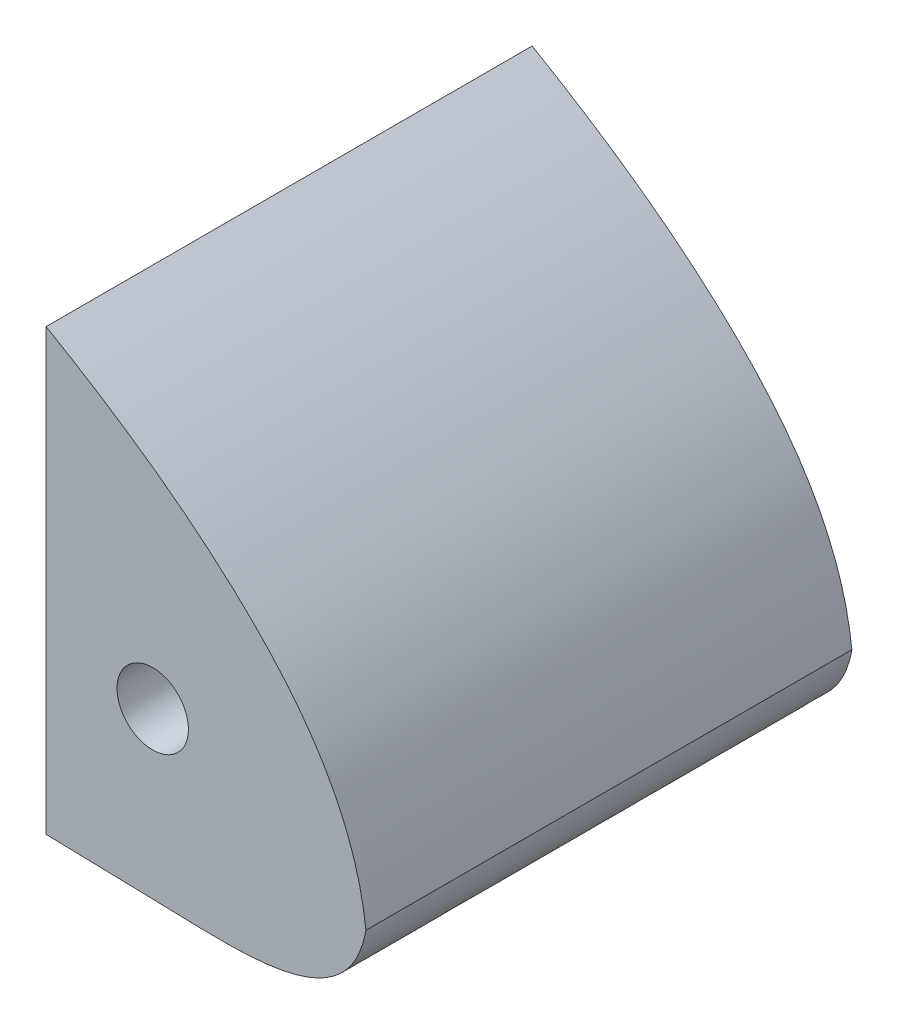
ISO-10303-21;
HEADER;
FILE_DESCRIPTION(('STEP AP214'),'2;1');
FILE_NAME('part.step','',(''),(''),'','','');
FILE_SCHEMA(('AUTOMOTIVE_DESIGN { 1 0 10303 214 1 1 1 1 }'));
ENDSEC;
DATA;
#1=APPLICATION_CONTEXT('core data for automotive mechanical design processes');
#2=APPLICATION_PROTOCOL_DEFINITION('international standard','automotive_design',2000,#1);
#3=PRODUCT_CONTEXT('',#1,'mechanical');
#4=PRODUCT('Part','Part','',(#3));
#5=PRODUCT_RELATED_PRODUCT_CATEGORY('part','',(#4));
#6=PRODUCT_DEFINITION_FORMATION('','',#4);
#7=PRODUCT_DEFINITION_CONTEXT('part definition',#1,'design');
#8=PRODUCT_DEFINITION('design','',#6,#7);
#9=PRODUCT_DEFINITION_SHAPE('','',#8);
#10=(LENGTH_UNIT() NAMED_UNIT(*) SI_UNIT(.MILLI.,.METRE.));
#11=(NAMED_UNIT(*) PLANE_ANGLE_UNIT() SI_UNIT($,.RADIAN.));
#12=(NAMED_UNIT(*) SI_UNIT($,.STERADIAN.) SOLID_ANGLE_UNIT());
#13=UNCERTAINTY_MEASURE_WITH_UNIT(LENGTH_MEASURE(1.E-05),#10,'distance_accuracy_value','');
#14=(GEOMETRIC_REPRESENTATION_CONTEXT(3) GLOBAL_UNCERTAINTY_ASSIGNED_CONTEXT((#13)) GLOBAL_UNIT_ASSIGNED_CONTEXT((#10,
#11,#12)) REPRESENTATION_CONTEXT('',''));
#15=CARTESIAN_POINT('',(0.,0.,0.));
#16=DIRECTION('',(0.,0.,1.));
#17=DIRECTION('',(1.,0.,0.));
#18=AXIS2_PLACEMENT_3D('',#15,#16,#17);
#19=CARTESIAN_POINT('',(6.23690674710793,-9.83282120050422,28.956));
#20=DIRECTION('',(0.,0.,1.));
#21=DIRECTION('',(1.,0.,0.));
#22=AXIS2_PLACEMENT_3D('',#19,#20,#21);
#23=PLANE('',#22);
#24=DIRECTION('',(0.,1.,0.));
#25=VECTOR('',#24,1.);
#26=CARTESIAN_POINT('',(57.1669962626333,30.6925003680842,28.956));
#27=LINE('',#26,#25);
#28=CARTESIAN_POINT('',(57.1669962626333,-16.8860620664663,28.956));
#29=VERTEX_POINT('',#28);
#30=CARTESIAN_POINT('',(57.1669962626792,9.31710177497897,28.956));
#31=VERTEX_POINT('',#30);
#32=EDGE_CURVE('E56',#29,#31,#27,.T.);
#33=ORIENTED_EDGE('',*,*,#32,.F.);
#34=CARTESIAN_POINT('',(-66.0069716290183,-5.63470862311887,28.956));
#35=CARTESIAN_POINT('',(-44.5940371879975,-5.53917687984291,28.956));
#36=CARTESIAN_POINT('',(-13.0130223079607,-6.72409850193042,28.956));
#37=CARTESIAN_POINT('',(26.1366565690305,-12.7508567541694,28.956));
#38=CARTESIAN_POINT('',(48.7652674229662,-16.9007642038902,28.956));
#39=CARTESIAN_POINT('',(64.6833626627234,-16.9690523934929,28.956));
#40=CARTESIAN_POINT('',(75.2906304926915,-17.5225292184952,28.956));
#41=CARTESIAN_POINT('',(76.2169962626333,-12.3082935907539,28.956));
#42=B_SPLINE_CURVE_WITH_KNOTS('',3,(#34,#35,#36,#37,#38,#39,#40,#41),.UNSPECIFIED.,.F.,.F.,(4,1,
1,1,1,4),(0.133250971952972,0.517329721776624,0.696666541434988,0.84940993817877,
0.919519723249622,1.),.UNSPECIFIED.);
#43=CARTESIAN_POINT('',(76.2169962626333,-12.3082935907539,28.956));
#44=VERTEX_POINT('',#43);
#45=EDGE_CURVE('E63',#29,#44,#42,.T.);
#46=ORIENTED_EDGE('',*,*,#45,.T.);
#47=CARTESIAN_POINT('',(76.2169962626333,-12.3082935907539,28.956));
#48=CARTESIAN_POINT('',(75.6069525390447,-6.76655965764841,28.956));
#49=CARTESIAN_POINT('',(69.7043006889504,1.13838920453428,28.956));
#50=CARTESIAN_POINT('',(56.4222366314094,10.2643835983855,28.956));
#51=CARTESIAN_POINT('',(36.9761031047391,19.3707728361886,28.956));
#52=CARTESIAN_POINT('',(8.74168720896823,24.8154039567916,28.956));
#53=CARTESIAN_POINT('',(-27.455234983126,23.566672909106,28.956));
#54=CARTESIAN_POINT('',(-52.387628687855,18.1036316509052,28.956));
#55=CARTESIAN_POINT('',(-66.0069716290183,14.9523239686121,28.956));
#56=B_SPLINE_CURVE_WITH_KNOTS('',3,(#47,#48,#49,#50,#51,#52,#53,#54,#55),.UNSPECIFIED.,.F.,.F.,
(4,1,1,1,1,1,4),(0.,0.0865869930935198,0.16173742787457,0.268322265449627,0.445156626621206,
0.638028872876503,0.87237087622276),.UNSPECIFIED.);
#57=EDGE_CURVE('E84',#44,#31,#56,.T.);
#58=ORIENTED_EDGE('',*,*,#57,.T.);
#59=EDGE_LOOP('',(#33,#46,#58));
#60=FACE_BOUND('',#59,.T.);
#61=CARTESIAN_POINT('',(63.5169962626333,-7.2282935907539,28.956));
#62=DIRECTION('',(0.,0.,1.));
#63=DIRECTION('',(1.,0.,0.));
#64=AXIS2_PLACEMENT_3D('',#61,#62,#63);
#65=CIRCLE('',#64,2.12700000000001);
#66=CARTESIAN_POINT('',(65.6439962626333,-7.2282935907539,28.956));
#67=VERTEX_POINT('',#66);
#68=EDGE_CURVE('E169',#67,#67,#65,.T.);
#69=ORIENTED_EDGE('',*,*,#68,.F.);
#70=EDGE_LOOP('',(#69));
#71=FACE_BOUND('',#70,.T.);
#72=ADVANCED_FACE('F39',(#60,#71),#23,.T.);
#73=CARTESIAN_POINT('',(6.23690674710793,-9.83282120050422,0.));
#74=DIRECTION('',(0.,0.,1.));
#75=DIRECTION('',(1.,0.,0.));
#76=AXIS2_PLACEMENT_3D('',#73,#74,#75);
#77=PLANE('',#76);
#78=CARTESIAN_POINT('',(-66.0069716290183,-5.63470862311887,0.));
#79=CARTESIAN_POINT('',(-44.5940371879975,-5.53917687984291,0.));
#80=CARTESIAN_POINT('',(-13.0130223079607,-6.72409850193042,0.));
#81=CARTESIAN_POINT('',(26.1366565690305,-12.7508567541694,0.));
#82=CARTESIAN_POINT('',(48.7652674229662,-16.9007642038902,0.));
#83=CARTESIAN_POINT('',(64.6833626627234,-16.9690523934929,0.));
#84=CARTESIAN_POINT('',(75.2906304926915,-17.5225292184952,0.));
#85=CARTESIAN_POINT('',(76.2169962626333,-12.3082935907539,0.));
#86=B_SPLINE_CURVE_WITH_KNOTS('',3,(#78,#79,#80,#81,#82,#83,#84,#85),.UNSPECIFIED.,.F.,.F.,(4,1,
1,1,1,4),(0.133250971952972,0.517329721776624,0.696666541434988,0.84940993817877,
0.919519723249622,1.),.UNSPECIFIED.);
#87=CARTESIAN_POINT('',(57.1669962626333,-16.8860620664663,0.));
#88=VERTEX_POINT('',#87);
#89=CARTESIAN_POINT('',(76.2169962626333,-12.3082935907539,0.));
#90=VERTEX_POINT('',#89);
#91=EDGE_CURVE('E95',#88,#90,#86,.T.);
#92=ORIENTED_EDGE('',*,*,#91,.F.);
#93=DIRECTION('',(0.,1.,0.));
#94=VECTOR('',#93,1.);
#95=CARTESIAN_POINT('',(57.1669962626333,30.6925003680842,0.));
#96=LINE('',#95,#94);
#97=CARTESIAN_POINT('',(57.1669962626333,9.31710177498079,0.));
#98=VERTEX_POINT('',#97);
#99=EDGE_CURVE('E77',#88,#98,#96,.T.);
#100=ORIENTED_EDGE('',*,*,#99,.T.);
#101=CARTESIAN_POINT('',(76.2169962626333,-12.3082935907539,0.));
#102=CARTESIAN_POINT('',(75.6069525390447,-6.76655965764841,0.));
#103=CARTESIAN_POINT('',(69.7043006889504,1.13838920453428,0.));
#104=CARTESIAN_POINT('',(56.4222366314094,10.2643835983855,0.));
#105=CARTESIAN_POINT('',(36.9761031047391,19.3707728361886,0.));
#106=CARTESIAN_POINT('',(8.74168720896823,24.8154039567916,0.));
#107=CARTESIAN_POINT('',(-27.455234983126,23.566672909106,0.));
#108=CARTESIAN_POINT('',(-52.387628687855,18.1036316509052,0.));
#109=CARTESIAN_POINT('',(-66.0069716290183,14.9523239686121,0.));
#110=B_SPLINE_CURVE_WITH_KNOTS('',3,(#101,#102,#103,#104,#105,#106,#107,#108,#109),
.UNSPECIFIED.,.F.,.F.,(4,1,1,1,1,1,4),(0.,0.0865869930935198,0.16173742787457,0.268322265449627,
0.445156626621206,0.638028872876503,0.87237087622276),.UNSPECIFIED.);
#111=EDGE_CURVE('E90',#90,#98,#110,.T.);
#112=ORIENTED_EDGE('',*,*,#111,.F.);
#113=EDGE_LOOP('',(#92,#100,#112));
#114=FACE_BOUND('',#113,.T.);
#115=CARTESIAN_POINT('',(63.5169962626333,-7.2282935907539,0.));
#116=DIRECTION('',(0.,0.,1.));
#117=DIRECTION('',(1.,0.,0.));
#118=AXIS2_PLACEMENT_3D('',#115,#116,#117);
#119=CIRCLE('',#118,2.12700000000001);
#120=CARTESIAN_POINT('',(65.6439962626333,-7.2282935907539,0.));
#121=VERTEX_POINT('',#120);
#122=EDGE_CURVE('E81',#121,#121,#119,.T.);
#123=ORIENTED_EDGE('',*,*,#122,.T.);
#124=EDGE_LOOP('',(#123));
#125=FACE_BOUND('',#124,.T.);
#126=ADVANCED_FACE('F119',(#114,#125),#77,.F.);
#127=DIRECTION('',(0.,0.,-1.));
#128=VECTOR('',#127,1.);
#129=SURFACE_OF_LINEAR_EXTRUSION('',#42,#128);
#130=ORIENTED_EDGE('',*,*,#45,.F.);
#131=DIRECTION('',(0.,0.,-1.));
#132=VECTOR('',#131,1.);
#133=CARTESIAN_POINT('',(57.1669962626333,-16.8860620665246,28.956));
#134=LINE('',#133,#132);
#135=EDGE_CURVE('E74',#29,#88,#134,.T.);
#136=ORIENTED_EDGE('',*,*,#135,.T.);
#137=ORIENTED_EDGE('',*,*,#91,.T.);
#138=DIRECTION('',(0.,0.,-1.));
#139=VECTOR('',#138,1.);
#140=CARTESIAN_POINT('',(76.2169962626333,-12.3082935907539,28.956));
#141=LINE('',#140,#139);
#142=EDGE_CURVE('E49',#44,#90,#141,.T.);
#143=ORIENTED_EDGE('',*,*,#142,.F.);
#144=EDGE_LOOP('',(#130,#136,#137,#143));
#145=FACE_BOUND('',#144,.T.);
#146=ADVANCED_FACE('F41',(#145),#129,.F.);
#147=DIRECTION('',(0.,0.,-1.));
#148=VECTOR('',#147,1.);
#149=SURFACE_OF_LINEAR_EXTRUSION('',#56,#148);
#150=ORIENTED_EDGE('',*,*,#111,.T.);
#151=DIRECTION('',(0.,0.,-1.));
#152=VECTOR('',#151,1.);
#153=CARTESIAN_POINT('',(57.1669962626333,9.31710177500563,28.956));
#154=LINE('',#153,#152);
#155=EDGE_CURVE('E11',#98,#31,#154,.F.);
#156=ORIENTED_EDGE('',*,*,#155,.T.);
#157=ORIENTED_EDGE('',*,*,#57,.F.);
#158=ORIENTED_EDGE('',*,*,#142,.T.);
#159=EDGE_LOOP('',(#150,#156,#157,#158));
#160=FACE_BOUND('',#159,.T.);
#161=ADVANCED_FACE('F114',(#160),#149,.F.);
#162=CARTESIAN_POINT('',(63.5169962626333,-7.2282935907539,28.956));
#163=DIRECTION('',(0.,0.,-1.));
#164=DIRECTION('',(-1.,0.,0.));
#165=AXIS2_PLACEMENT_3D('',#162,#163,#164);
#166=CYLINDRICAL_SURFACE('',#165,2.12700000000001);
#167=ORIENTED_EDGE('',*,*,#68,.T.);
#168=EDGE_LOOP('',(#167));
#169=FACE_BOUND('',#168,.T.);
#170=ORIENTED_EDGE('',*,*,#122,.F.);
#171=EDGE_LOOP('',(#170));
#172=FACE_BOUND('',#171,.T.);
#173=ADVANCED_FACE('F117',(#169,#172),#166,.F.);
#174=CARTESIAN_POINT('',(57.1669962626333,30.6925003680842,0.));
#175=DIRECTION('',(1.,0.,0.));
#176=DIRECTION('',(0.,0.,-1.));
#177=AXIS2_PLACEMENT_3D('',#174,#175,#176);
#178=PLANE('',#177);
#179=ORIENTED_EDGE('',*,*,#32,.T.);
#180=ORIENTED_EDGE('',*,*,#155,.F.);
#181=ORIENTED_EDGE('',*,*,#99,.F.);
#182=ORIENTED_EDGE('',*,*,#135,.F.);
#183=EDGE_LOOP('',(#179,#180,#181,#182));
#184=FACE_BOUND('',#183,.T.);
#185=ADVANCED_FACE('F75',(#184),#178,.F.);
#186=CLOSED_SHELL('',(#72,#126,#146,#161,#173,#185));
#187=MANIFOLD_SOLID_BREP('B2',#186);
#188=ADVANCED_BREP_SHAPE_REPRESENTATION('',(#18,#187),#14);
#189=SHAPE_DEFINITION_REPRESENTATION(#9,#188);
ENDSEC;
END-ISO-10303-21;
